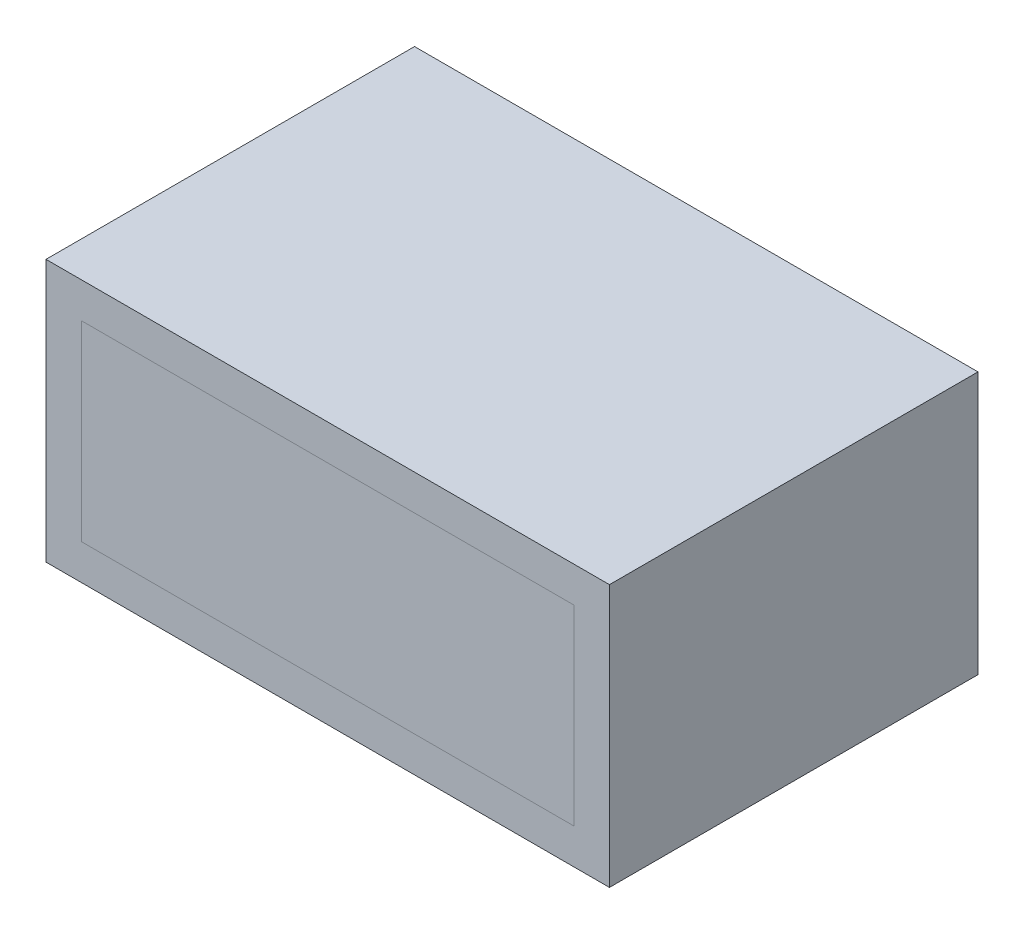
ISO-10303-21;
HEADER;
FILE_DESCRIPTION(('STEP AP214'),'2;1');
FILE_NAME('part.step','',(''),(''),'','','');
FILE_SCHEMA(('AUTOMOTIVE_DESIGN { 1 0 10303 214 1 1 1 1 }'));
ENDSEC;
DATA;
#1=APPLICATION_CONTEXT('core data for automotive mechanical design processes');
#2=APPLICATION_PROTOCOL_DEFINITION('international standard','automotive_design',2000,#1);
#3=PRODUCT_CONTEXT('',#1,'mechanical');
#4=PRODUCT('Part','Part','',(#3));
#5=PRODUCT_RELATED_PRODUCT_CATEGORY('part','',(#4));
#6=PRODUCT_DEFINITION_FORMATION('','',#4);
#7=PRODUCT_DEFINITION_CONTEXT('part definition',#1,'design');
#8=PRODUCT_DEFINITION('design','',#6,#7);
#9=PRODUCT_DEFINITION_SHAPE('','',#8);
#10=(LENGTH_UNIT() NAMED_UNIT(*) SI_UNIT(.MILLI.,.METRE.));
#11=(NAMED_UNIT(*) PLANE_ANGLE_UNIT() SI_UNIT($,.RADIAN.));
#12=(NAMED_UNIT(*) SI_UNIT($,.STERADIAN.) SOLID_ANGLE_UNIT());
#13=UNCERTAINTY_MEASURE_WITH_UNIT(LENGTH_MEASURE(1.E-05),#10,'distance_accuracy_value','');
#14=(GEOMETRIC_REPRESENTATION_CONTEXT(3) GLOBAL_UNCERTAINTY_ASSIGNED_CONTEXT((#13)) GLOBAL_UNIT_ASSIGNED_CONTEXT((#10,
#11,#12)) REPRESENTATION_CONTEXT('',''));
#15=CARTESIAN_POINT('',(0.,0.,0.));
#16=DIRECTION('',(0.,0.,1.));
#17=DIRECTION('',(1.,0.,0.));
#18=AXIS2_PLACEMENT_3D('',#15,#16,#17);
#19=CARTESIAN_POINT('',(0.,0.,0.));
#20=DIRECTION('',(0.,0.,1.));
#21=DIRECTION('',(1.,0.,0.));
#22=AXIS2_PLACEMENT_3D('',#19,#20,#21);
#23=PLANE('',#22);
#24=DIRECTION('',(1.,0.,0.));
#25=VECTOR('',#24,1.);
#26=CARTESIAN_POINT('',(-79.5,37.,0.));
#27=LINE('',#26,#25);
#28=CARTESIAN_POINT('',(-79.5,37.,0.));
#29=VERTEX_POINT('',#28);
#30=CARTESIAN_POINT('',(79.5,37.,0.));
#31=VERTEX_POINT('',#30);
#32=EDGE_CURVE('P0_E20',#29,#31,#27,.T.);
#33=ORIENTED_EDGE('',*,*,#32,.T.);
#34=DIRECTION('',(0.,-1.,0.));
#35=VECTOR('',#34,1.);
#36=CARTESIAN_POINT('',(79.5,37.,0.));
#37=LINE('',#36,#35);
#38=CARTESIAN_POINT('',(79.5,-37.,0.));
#39=VERTEX_POINT('',#38);
#40=EDGE_CURVE('P0_E89',#31,#39,#37,.T.);
#41=ORIENTED_EDGE('',*,*,#40,.T.);
#42=DIRECTION('',(-1.,0.,0.));
#43=VECTOR('',#42,1.);
#44=CARTESIAN_POINT('',(79.5,-37.,0.));
#45=LINE('',#44,#43);
#46=CARTESIAN_POINT('',(-79.5,-37.,0.));
#47=VERTEX_POINT('',#46);
#48=EDGE_CURVE('P0_E82',#39,#47,#45,.T.);
#49=ORIENTED_EDGE('',*,*,#48,.T.);
#50=DIRECTION('',(0.,1.,0.));
#51=VECTOR('',#50,1.);
#52=CARTESIAN_POINT('',(-79.5,-37.,0.));
#53=LINE('',#52,#51);
#54=EDGE_CURVE('P0_E66',#47,#29,#53,.T.);
#55=ORIENTED_EDGE('',*,*,#54,.T.);
#56=EDGE_LOOP('',(#33,#41,#49,#55));
#57=FACE_BOUND('',#56,.T.);
#58=ADVANCED_FACE('P0_F17',(#57),#23,.F.);
#59=CARTESIAN_POINT('',(0.,0.,104.));
#60=DIRECTION('',(0.,0.,1.));
#61=DIRECTION('',(1.,0.,0.));
#62=AXIS2_PLACEMENT_3D('',#59,#60,#61);
#63=PLANE('',#62);
#64=DIRECTION('',(0.,-1.,0.));
#65=VECTOR('',#64,1.);
#66=CARTESIAN_POINT('',(69.5,-18.5,104.));
#67=LINE('',#66,#65);
#68=CARTESIAN_POINT('',(69.5,27.,104.));
#69=VERTEX_POINT('',#68);
#70=CARTESIAN_POINT('',(69.5,-27.,104.));
#71=VERTEX_POINT('',#70);
#72=EDGE_CURVE('P0_E165',#69,#71,#67,.T.);
#73=ORIENTED_EDGE('',*,*,#72,.T.);
#74=DIRECTION('',(-1.,0.,0.));
#75=VECTOR('',#74,1.);
#76=CARTESIAN_POINT('',(-39.75,-27.,104.));
#77=LINE('',#76,#75);
#78=CARTESIAN_POINT('',(-69.5,-27.,104.));
#79=VERTEX_POINT('',#78);
#80=EDGE_CURVE('P0_E185',#71,#79,#77,.T.);
#81=ORIENTED_EDGE('',*,*,#80,.T.);
#82=DIRECTION('',(0.,1.,0.));
#83=VECTOR('',#82,1.);
#84=CARTESIAN_POINT('',(-69.5,18.5,104.));
#85=LINE('',#84,#83);
#86=CARTESIAN_POINT('',(-69.5,27.,104.));
#87=VERTEX_POINT('',#86);
#88=EDGE_CURVE('P0_E133',#79,#87,#85,.T.);
#89=ORIENTED_EDGE('',*,*,#88,.T.);
#90=DIRECTION('',(1.,0.,0.));
#91=VECTOR('',#90,1.);
#92=CARTESIAN_POINT('',(39.75,27.,104.));
#93=LINE('',#92,#91);
#94=EDGE_CURVE('P0_E122',#87,#69,#93,.T.);
#95=ORIENTED_EDGE('',*,*,#94,.T.);
#96=EDGE_LOOP('',(#73,#81,#89,#95));
#97=FACE_BOUND('',#96,.T.);
#98=DIRECTION('',(-1.,0.,0.));
#99=VECTOR('',#98,1.);
#100=CARTESIAN_POINT('',(-79.5,37.,104.));
#101=LINE('',#100,#99);
#102=CARTESIAN_POINT('',(79.5,37.,104.));
#103=VERTEX_POINT('',#102);
#104=CARTESIAN_POINT('',(-79.5,37.,104.));
#105=VERTEX_POINT('',#104);
#106=EDGE_CURVE('P0_E11',#103,#105,#101,.T.);
#107=ORIENTED_EDGE('',*,*,#106,.T.);
#108=DIRECTION('',(0.,-1.,0.));
#109=VECTOR('',#108,1.);
#110=CARTESIAN_POINT('',(-79.5,-37.,104.));
#111=LINE('',#110,#109);
#112=CARTESIAN_POINT('',(-79.5,-37.,104.));
#113=VERTEX_POINT('',#112);
#114=EDGE_CURVE('P0_E76',#105,#113,#111,.T.);
#115=ORIENTED_EDGE('',*,*,#114,.T.);
#116=DIRECTION('',(1.,0.,0.));
#117=VECTOR('',#116,1.);
#118=CARTESIAN_POINT('',(79.5,-37.,104.));
#119=LINE('',#118,#117);
#120=CARTESIAN_POINT('',(79.5,-37.,104.));
#121=VERTEX_POINT('',#120);
#122=EDGE_CURVE('P0_E84',#113,#121,#119,.T.);
#123=ORIENTED_EDGE('',*,*,#122,.T.);
#124=DIRECTION('',(0.,1.,0.));
#125=VECTOR('',#124,1.);
#126=CARTESIAN_POINT('',(79.5,37.,104.));
#127=LINE('',#126,#125);
#128=EDGE_CURVE('P0_E98',#121,#103,#127,.T.);
#129=ORIENTED_EDGE('',*,*,#128,.T.);
#130=EDGE_LOOP('',(#107,#115,#123,#129));
#131=FACE_BOUND('',#130,.T.);
#132=ADVANCED_FACE('P0_F232',(#97,#131),#63,.T.);
#133=CARTESIAN_POINT('',(79.5,37.,0.));
#134=DIRECTION('',(0.,1.,0.));
#135=DIRECTION('',(1.,0.,0.));
#136=AXIS2_PLACEMENT_3D('',#133,#134,#135);
#137=PLANE('',#136);
#138=ORIENTED_EDGE('',*,*,#32,.F.);
#139=DIRECTION('',(0.,0.,1.));
#140=VECTOR('',#139,1.);
#141=CARTESIAN_POINT('',(-79.5,37.,0.));
#142=LINE('',#141,#140);
#143=EDGE_CURVE('P0_E72',#29,#105,#142,.T.);
#144=ORIENTED_EDGE('',*,*,#143,.T.);
#145=ORIENTED_EDGE('',*,*,#106,.F.);
#146=DIRECTION('',(0.,0.,1.));
#147=VECTOR('',#146,1.);
#148=CARTESIAN_POINT('',(79.5,37.,0.));
#149=LINE('',#148,#147);
#150=EDGE_CURVE('P0_E114',#31,#103,#149,.T.);
#151=ORIENTED_EDGE('',*,*,#150,.F.);
#152=EDGE_LOOP('',(#138,#144,#145,#151));
#153=FACE_BOUND('',#152,.T.);
#154=ADVANCED_FACE('P0_F115',(#153),#137,.T.);
#155=CARTESIAN_POINT('',(-79.5,37.,0.));
#156=DIRECTION('',(-1.,0.,0.));
#157=DIRECTION('',(0.,1.,0.));
#158=AXIS2_PLACEMENT_3D('',#155,#156,#157);
#159=PLANE('',#158);
#160=ORIENTED_EDGE('',*,*,#54,.F.);
#161=DIRECTION('',(0.,0.,1.));
#162=VECTOR('',#161,1.);
#163=CARTESIAN_POINT('',(-79.5,-37.,0.));
#164=LINE('',#163,#162);
#165=EDGE_CURVE('P0_E70',#47,#113,#164,.T.);
#166=ORIENTED_EDGE('',*,*,#165,.T.);
#167=ORIENTED_EDGE('',*,*,#114,.F.);
#168=ORIENTED_EDGE('',*,*,#143,.F.);
#169=EDGE_LOOP('',(#160,#166,#167,#168));
#170=FACE_BOUND('',#169,.T.);
#171=ADVANCED_FACE('P0_F68',(#170),#159,.T.);
#172=CARTESIAN_POINT('',(-79.5,-37.,0.));
#173=DIRECTION('',(0.,-1.,0.));
#174=DIRECTION('',(0.,0.,-1.));
#175=AXIS2_PLACEMENT_3D('',#172,#173,#174);
#176=PLANE('',#175);
#177=ORIENTED_EDGE('',*,*,#48,.F.);
#178=DIRECTION('',(0.,0.,1.));
#179=VECTOR('',#178,1.);
#180=CARTESIAN_POINT('',(79.5,-37.,0.));
#181=LINE('',#180,#179);
#182=EDGE_CURVE('P0_E91',#39,#121,#181,.T.);
#183=ORIENTED_EDGE('',*,*,#182,.T.);
#184=ORIENTED_EDGE('',*,*,#122,.F.);
#185=ORIENTED_EDGE('',*,*,#165,.F.);
#186=EDGE_LOOP('',(#177,#183,#184,#185));
#187=FACE_BOUND('',#186,.T.);
#188=ADVANCED_FACE('P0_F80',(#187),#176,.T.);
#189=CARTESIAN_POINT('',(79.5,-37.,0.));
#190=DIRECTION('',(1.,0.,0.));
#191=DIRECTION('',(0.,1.,0.));
#192=AXIS2_PLACEMENT_3D('',#189,#190,#191);
#193=PLANE('',#192);
#194=ORIENTED_EDGE('',*,*,#40,.F.);
#195=ORIENTED_EDGE('',*,*,#150,.T.);
#196=ORIENTED_EDGE('',*,*,#128,.F.);
#197=ORIENTED_EDGE('',*,*,#182,.F.);
#198=EDGE_LOOP('',(#194,#195,#196,#197));
#199=FACE_BOUND('',#198,.T.);
#200=ADVANCED_FACE('P0_F120',(#199),#193,.T.);
#201=CARTESIAN_POINT('',(0.,0.,10.));
#202=DIRECTION('',(0.,0.,1.));
#203=DIRECTION('',(1.,0.,0.));
#204=AXIS2_PLACEMENT_3D('',#201,#202,#203);
#205=PLANE('',#204);
#206=DIRECTION('',(1.,0.,0.));
#207=VECTOR('',#206,1.);
#208=CARTESIAN_POINT('',(39.75,27.,10.));
#209=LINE('',#208,#207);
#210=CARTESIAN_POINT('',(-69.5,27.,10.));
#211=VERTEX_POINT('',#210);
#212=CARTESIAN_POINT('',(69.5,27.,10.));
#213=VERTEX_POINT('',#212);
#214=EDGE_CURVE('P0_E128',#211,#213,#209,.T.);
#215=ORIENTED_EDGE('',*,*,#214,.F.);
#216=DIRECTION('',(0.,1.,0.));
#217=VECTOR('',#216,1.);
#218=CARTESIAN_POINT('',(-69.5,18.5,10.));
#219=LINE('',#218,#217);
#220=CARTESIAN_POINT('',(-69.5,-27.,10.));
#221=VERTEX_POINT('',#220);
#222=EDGE_CURVE('P0_E189',#221,#211,#219,.T.);
#223=ORIENTED_EDGE('',*,*,#222,.F.);
#224=DIRECTION('',(-1.,0.,0.));
#225=VECTOR('',#224,1.);
#226=CARTESIAN_POINT('',(-39.75,-27.,10.));
#227=LINE('',#226,#225);
#228=CARTESIAN_POINT('',(69.5,-27.,10.));
#229=VERTEX_POINT('',#228);
#230=EDGE_CURVE('P0_E167',#229,#221,#227,.T.);
#231=ORIENTED_EDGE('',*,*,#230,.F.);
#232=DIRECTION('',(0.,-1.,0.));
#233=VECTOR('',#232,1.);
#234=CARTESIAN_POINT('',(69.5,-18.5,10.));
#235=LINE('',#234,#233);
#236=EDGE_CURVE('P0_E163',#213,#229,#235,.T.);
#237=ORIENTED_EDGE('',*,*,#236,.F.);
#238=EDGE_LOOP('',(#215,#223,#231,#237));
#239=FACE_BOUND('',#238,.T.);
#240=ADVANCED_FACE('P0_F170',(#239),#205,.T.);
#241=CARTESIAN_POINT('',(79.5,27.,0.));
#242=DIRECTION('',(0.,1.,0.));
#243=DIRECTION('',(1.,0.,0.));
#244=AXIS2_PLACEMENT_3D('',#241,#242,#243);
#245=PLANE('',#244);
#246=ORIENTED_EDGE('',*,*,#214,.T.);
#247=DIRECTION('',(0.,0.,1.));
#248=VECTOR('',#247,1.);
#249=CARTESIAN_POINT('',(69.5,27.,0.));
#250=LINE('',#249,#248);
#251=EDGE_CURVE('P0_E148',#213,#69,#250,.T.);
#252=ORIENTED_EDGE('',*,*,#251,.T.);
#253=ORIENTED_EDGE('',*,*,#94,.F.);
#254=DIRECTION('',(0.,0.,1.));
#255=VECTOR('',#254,1.);
#256=CARTESIAN_POINT('',(-69.5,27.,0.));
#257=LINE('',#256,#255);
#258=EDGE_CURVE('P0_E131',#211,#87,#257,.T.);
#259=ORIENTED_EDGE('',*,*,#258,.F.);
#260=EDGE_LOOP('',(#246,#252,#253,#259));
#261=FACE_BOUND('',#260,.T.);
#262=ADVANCED_FACE('P0_F145',(#261),#245,.F.);
#263=CARTESIAN_POINT('',(-69.5,37.,0.));
#264=DIRECTION('',(-1.,0.,0.));
#265=DIRECTION('',(0.,1.,0.));
#266=AXIS2_PLACEMENT_3D('',#263,#264,#265);
#267=PLANE('',#266);
#268=ORIENTED_EDGE('',*,*,#222,.T.);
#269=ORIENTED_EDGE('',*,*,#258,.T.);
#270=ORIENTED_EDGE('',*,*,#88,.F.);
#271=DIRECTION('',(0.,0.,1.));
#272=VECTOR('',#271,1.);
#273=CARTESIAN_POINT('',(-69.5,-27.,0.));
#274=LINE('',#273,#272);
#275=EDGE_CURVE('P0_E184',#221,#79,#274,.T.);
#276=ORIENTED_EDGE('',*,*,#275,.F.);
#277=EDGE_LOOP('',(#268,#269,#270,#276));
#278=FACE_BOUND('',#277,.T.);
#279=ADVANCED_FACE('P0_F199',(#278),#267,.F.);
#280=CARTESIAN_POINT('',(-79.5,-27.,0.));
#281=DIRECTION('',(0.,-1.,0.));
#282=DIRECTION('',(0.,0.,-1.));
#283=AXIS2_PLACEMENT_3D('',#280,#281,#282);
#284=PLANE('',#283);
#285=ORIENTED_EDGE('',*,*,#230,.T.);
#286=ORIENTED_EDGE('',*,*,#275,.T.);
#287=ORIENTED_EDGE('',*,*,#80,.F.);
#288=DIRECTION('',(0.,0.,1.));
#289=VECTOR('',#288,1.);
#290=CARTESIAN_POINT('',(69.5,-27.,0.));
#291=LINE('',#290,#289);
#292=EDGE_CURVE('P0_E174',#229,#71,#291,.T.);
#293=ORIENTED_EDGE('',*,*,#292,.F.);
#294=EDGE_LOOP('',(#285,#286,#287,#293));
#295=FACE_BOUND('',#294,.T.);
#296=ADVANCED_FACE('P0_F282',(#295),#284,.F.);
#297=CARTESIAN_POINT('',(69.5,-37.,0.));
#298=DIRECTION('',(1.,0.,0.));
#299=DIRECTION('',(0.,1.,0.));
#300=AXIS2_PLACEMENT_3D('',#297,#298,#299);
#301=PLANE('',#300);
#302=ORIENTED_EDGE('',*,*,#236,.T.);
#303=ORIENTED_EDGE('',*,*,#292,.T.);
#304=ORIENTED_EDGE('',*,*,#72,.F.);
#305=ORIENTED_EDGE('',*,*,#251,.F.);
#306=EDGE_LOOP('',(#302,#303,#304,#305));
#307=FACE_BOUND('',#306,.T.);
#308=ADVANCED_FACE('P0_F161',(#307),#301,.F.);
#309=CLOSED_SHELL('',(#58,#132,#154,#171,#188,#200,#240,#262,#279,#296,#308));
#310=MANIFOLD_SOLID_BREP('P0_B1',#309);
#311=CARTESIAN_POINT('',(0.,0.,10.));
#312=DIRECTION('',(0.,0.,1.));
#313=DIRECTION('',(1.,0.,0.));
#314=AXIS2_PLACEMENT_3D('',#311,#312,#313);
#315=PLANE('',#314);
#316=DIRECTION('',(1.,0.,0.));
#317=VECTOR('',#316,1.);
#318=CARTESIAN_POINT('',(39.75,27.,10.));
#319=LINE('',#318,#317);
#320=CARTESIAN_POINT('',(-69.5,27.,10.));
#321=VERTEX_POINT('',#320);
#322=CARTESIAN_POINT('',(69.5,27.,10.));
#323=VERTEX_POINT('',#322);
#324=EDGE_CURVE('P1_E27',#321,#323,#319,.T.);
#325=ORIENTED_EDGE('',*,*,#324,.T.);
#326=DIRECTION('',(0.,-1.,0.));
#327=VECTOR('',#326,1.);
#328=CARTESIAN_POINT('',(69.5,-18.5,10.));
#329=LINE('',#328,#327);
#330=CARTESIAN_POINT('',(69.5,-27.,10.));
#331=VERTEX_POINT('',#330);
#332=EDGE_CURVE('P1_E97',#323,#331,#329,.T.);
#333=ORIENTED_EDGE('',*,*,#332,.T.);
#334=DIRECTION('',(-1.,0.,0.));
#335=VECTOR('',#334,1.);
#336=CARTESIAN_POINT('',(-39.75,-27.,10.));
#337=LINE('',#336,#335);
#338=CARTESIAN_POINT('',(-69.5,-27.,10.));
#339=VERTEX_POINT('',#338);
#340=EDGE_CURVE('P1_E80',#331,#339,#337,.T.);
#341=ORIENTED_EDGE('',*,*,#340,.T.);
#342=DIRECTION('',(0.,1.,0.));
#343=VECTOR('',#342,1.);
#344=CARTESIAN_POINT('',(-69.5,18.5,10.));
#345=LINE('',#344,#343);
#346=EDGE_CURVE('P1_E65',#339,#321,#345,.T.);
#347=ORIENTED_EDGE('',*,*,#346,.T.);
#348=EDGE_LOOP('',(#325,#333,#341,#347));
#349=FACE_BOUND('',#348,.T.);
#350=ADVANCED_FACE('P1_F17',(#349),#315,.F.);
#351=CARTESIAN_POINT('',(0.,0.,104.));
#352=DIRECTION('',(0.,0.,1.));
#353=DIRECTION('',(1.,0.,0.));
#354=AXIS2_PLACEMENT_3D('',#351,#352,#353);
#355=PLANE('',#354);
#356=DIRECTION('',(-1.,0.,0.));
#357=VECTOR('',#356,1.);
#358=CARTESIAN_POINT('',(39.75,27.,104.));
#359=LINE('',#358,#357);
#360=CARTESIAN_POINT('',(69.5,27.,104.));
#361=VERTEX_POINT('',#360);
#362=CARTESIAN_POINT('',(-69.5,27.,104.));
#363=VERTEX_POINT('',#362);
#364=EDGE_CURVE('P1_E11',#361,#363,#359,.T.);
#365=ORIENTED_EDGE('',*,*,#364,.T.);
#366=DIRECTION('',(0.,-1.,0.));
#367=VECTOR('',#366,1.);
#368=CARTESIAN_POINT('',(-69.5,18.5,104.));
#369=LINE('',#368,#367);
#370=CARTESIAN_POINT('',(-69.5,-27.,104.));
#371=VERTEX_POINT('',#370);
#372=EDGE_CURVE('P1_E20',#363,#371,#369,.T.);
#373=ORIENTED_EDGE('',*,*,#372,.T.);
#374=DIRECTION('',(1.,0.,0.));
#375=VECTOR('',#374,1.);
#376=CARTESIAN_POINT('',(-39.75,-27.,104.));
#377=LINE('',#376,#375);
#378=CARTESIAN_POINT('',(69.5,-27.,104.));
#379=VERTEX_POINT('',#378);
#380=EDGE_CURVE('P1_E59',#371,#379,#377,.T.);
#381=ORIENTED_EDGE('',*,*,#380,.T.);
#382=DIRECTION('',(0.,1.,0.));
#383=VECTOR('',#382,1.);
#384=CARTESIAN_POINT('',(69.5,-18.5,104.));
#385=LINE('',#384,#383);
#386=EDGE_CURVE('P1_E102',#379,#361,#385,.T.);
#387=ORIENTED_EDGE('',*,*,#386,.T.);
#388=EDGE_LOOP('',(#365,#373,#381,#387));
#389=FACE_BOUND('',#388,.T.);
#390=ADVANCED_FACE('P1_F57',(#389),#355,.T.);
#391=CARTESIAN_POINT('',(69.5,27.,10.));
#392=DIRECTION('',(0.,1.,0.));
#393=DIRECTION('',(1.,0.,0.));
#394=AXIS2_PLACEMENT_3D('',#391,#392,#393);
#395=PLANE('',#394);
#396=ORIENTED_EDGE('',*,*,#324,.F.);
#397=DIRECTION('',(0.,0.,1.));
#398=VECTOR('',#397,1.);
#399=CARTESIAN_POINT('',(-69.5,27.,10.));
#400=LINE('',#399,#398);
#401=EDGE_CURVE('P1_E64',#321,#363,#400,.T.);
#402=ORIENTED_EDGE('',*,*,#401,.T.);
#403=ORIENTED_EDGE('',*,*,#364,.F.);
#404=DIRECTION('',(0.,0.,1.));
#405=VECTOR('',#404,1.);
#406=CARTESIAN_POINT('',(69.5,27.,10.));
#407=LINE('',#406,#405);
#408=EDGE_CURVE('P1_E109',#323,#361,#407,.T.);
#409=ORIENTED_EDGE('',*,*,#408,.F.);
#410=EDGE_LOOP('',(#396,#402,#403,#409));
#411=FACE_BOUND('',#410,.T.);
#412=ADVANCED_FACE('P1_F116',(#411),#395,.T.);
#413=CARTESIAN_POINT('',(-69.5,27.,10.));
#414=DIRECTION('',(-1.,0.,0.));
#415=DIRECTION('',(0.,1.,0.));
#416=AXIS2_PLACEMENT_3D('',#413,#414,#415);
#417=PLANE('',#416);
#418=ORIENTED_EDGE('',*,*,#346,.F.);
#419=DIRECTION('',(0.,0.,1.));
#420=VECTOR('',#419,1.);
#421=CARTESIAN_POINT('',(-69.5,-27.,10.));
#422=LINE('',#421,#420);
#423=EDGE_CURVE('P1_E67',#339,#371,#422,.T.);
#424=ORIENTED_EDGE('',*,*,#423,.T.);
#425=ORIENTED_EDGE('',*,*,#372,.F.);
#426=ORIENTED_EDGE('',*,*,#401,.F.);
#427=EDGE_LOOP('',(#418,#424,#425,#426));
#428=FACE_BOUND('',#427,.T.);
#429=ADVANCED_FACE('P1_F68',(#428),#417,.T.);
#430=CARTESIAN_POINT('',(-69.5,-27.,10.));
#431=DIRECTION('',(0.,-1.,0.));
#432=DIRECTION('',(0.,0.,-1.));
#433=AXIS2_PLACEMENT_3D('',#430,#431,#432);
#434=PLANE('',#433);
#435=ORIENTED_EDGE('',*,*,#340,.F.);
#436=DIRECTION('',(0.,0.,1.));
#437=VECTOR('',#436,1.);
#438=CARTESIAN_POINT('',(69.5,-27.,10.));
#439=LINE('',#438,#437);
#440=EDGE_CURVE('P1_E77',#331,#379,#439,.T.);
#441=ORIENTED_EDGE('',*,*,#440,.T.);
#442=ORIENTED_EDGE('',*,*,#380,.F.);
#443=ORIENTED_EDGE('',*,*,#423,.F.);
#444=EDGE_LOOP('',(#435,#441,#442,#443));
#445=FACE_BOUND('',#444,.T.);
#446=ADVANCED_FACE('P1_F75',(#445),#434,.T.);
#447=CARTESIAN_POINT('',(69.5,-27.,10.));
#448=DIRECTION('',(1.,0.,0.));
#449=DIRECTION('',(0.,1.,0.));
#450=AXIS2_PLACEMENT_3D('',#447,#448,#449);
#451=PLANE('',#450);
#452=ORIENTED_EDGE('',*,*,#332,.F.);
#453=ORIENTED_EDGE('',*,*,#408,.T.);
#454=ORIENTED_EDGE('',*,*,#386,.F.);
#455=ORIENTED_EDGE('',*,*,#440,.F.);
#456=EDGE_LOOP('',(#452,#453,#454,#455));
#457=FACE_BOUND('',#456,.T.);
#458=ADVANCED_FACE('P1_F100',(#457),#451,.T.);
#459=CLOSED_SHELL('',(#350,#390,#412,#429,#446,#458));
#460=MANIFOLD_SOLID_BREP('P1_B1',#459);
#461=ADVANCED_BREP_SHAPE_REPRESENTATION('',(#18,#310,#460),#14);
#462=SHAPE_DEFINITION_REPRESENTATION(#9,#461);
ENDSEC;
END-ISO-10303-21;
